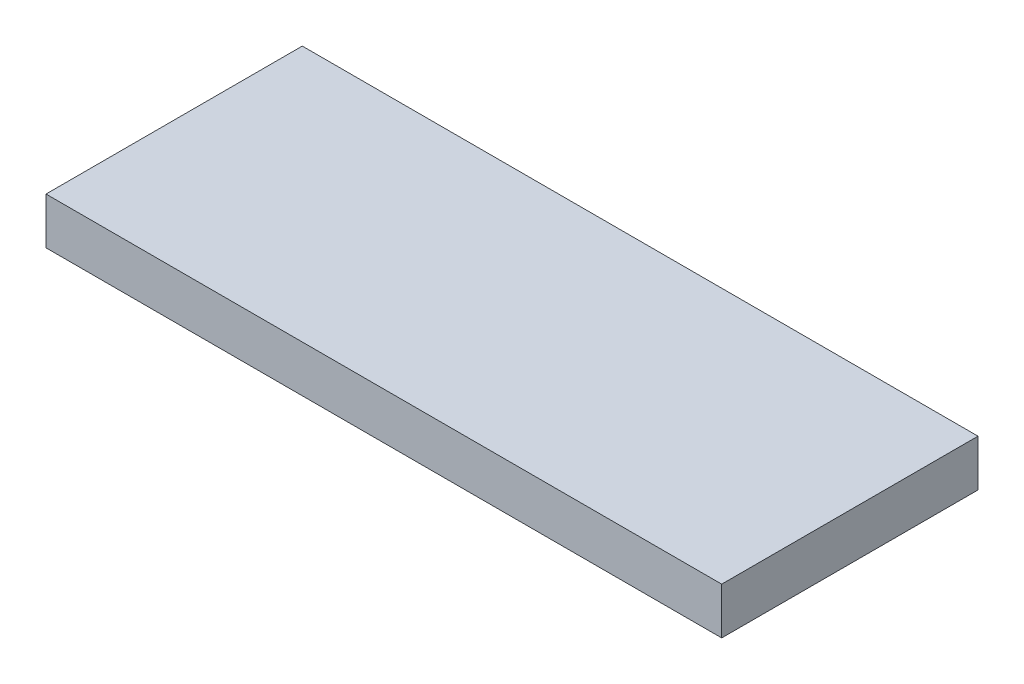
ISO-10303-21;
HEADER;
FILE_DESCRIPTION(('STEP AP214'),'2;1');
FILE_NAME('part.step','',(''),(''),'','','');
FILE_SCHEMA(('AUTOMOTIVE_DESIGN { 1 0 10303 214 1 1 1 1 }'));
ENDSEC;
DATA;
#1=APPLICATION_CONTEXT('core data for automotive mechanical design processes');
#2=APPLICATION_PROTOCOL_DEFINITION('international standard','automotive_design',2000,#1);
#3=PRODUCT_CONTEXT('',#1,'mechanical');
#4=PRODUCT('Part','Part','',(#3));
#5=PRODUCT_RELATED_PRODUCT_CATEGORY('part','',(#4));
#6=PRODUCT_DEFINITION_FORMATION('','',#4);
#7=PRODUCT_DEFINITION_CONTEXT('part definition',#1,'design');
#8=PRODUCT_DEFINITION('design','',#6,#7);
#9=PRODUCT_DEFINITION_SHAPE('','',#8);
#10=(LENGTH_UNIT() NAMED_UNIT(*) SI_UNIT(.MILLI.,.METRE.));
#11=(NAMED_UNIT(*) PLANE_ANGLE_UNIT() SI_UNIT($,.RADIAN.));
#12=(NAMED_UNIT(*) SI_UNIT($,.STERADIAN.) SOLID_ANGLE_UNIT());
#13=UNCERTAINTY_MEASURE_WITH_UNIT(LENGTH_MEASURE(1.E-05),#10,'distance_accuracy_value','');
#14=(GEOMETRIC_REPRESENTATION_CONTEXT(3) GLOBAL_UNCERTAINTY_ASSIGNED_CONTEXT((#13)) GLOBAL_UNIT_ASSIGNED_CONTEXT((#10,
#11,#12)) REPRESENTATION_CONTEXT('',''));
#15=CARTESIAN_POINT('',(0.,0.,0.));
#16=DIRECTION('',(0.,0.,1.));
#17=DIRECTION('',(1.,0.,0.));
#18=AXIS2_PLACEMENT_3D('',#15,#16,#17);
#19=CARTESIAN_POINT('',(184.15,25.4,-69.85));
#20=DIRECTION('',(-1.,0.,0.));
#21=DIRECTION('',(0.,0.,1.));
#22=AXIS2_PLACEMENT_3D('',#19,#20,#21);
#23=PLANE('',#22);
#24=DIRECTION('',(0.,0.,-1.));
#25=VECTOR('',#24,1.);
#26=CARTESIAN_POINT('',(184.15,0.,-69.85));
#27=LINE('',#26,#25);
#28=CARTESIAN_POINT('',(184.15,0.,69.85));
#29=VERTEX_POINT('',#28);
#30=CARTESIAN_POINT('',(184.15,0.,-69.85));
#31=VERTEX_POINT('',#30);
#32=EDGE_CURVE('E105',#29,#31,#27,.T.);
#33=ORIENTED_EDGE('',*,*,#32,.T.);
#34=DIRECTION('',(0.,-1.,0.));
#35=VECTOR('',#34,1.);
#36=CARTESIAN_POINT('',(184.15,25.4,-69.85));
#37=LINE('',#36,#35);
#38=CARTESIAN_POINT('',(184.15,25.4,-69.85));
#39=VERTEX_POINT('',#38);
#40=EDGE_CURVE('E11',#39,#31,#37,.T.);
#41=ORIENTED_EDGE('',*,*,#40,.F.);
#42=DIRECTION('',(0.,0.,-1.));
#43=VECTOR('',#42,1.);
#44=CARTESIAN_POINT('',(184.15,25.4,-69.85));
#45=LINE('',#44,#43);
#46=CARTESIAN_POINT('',(184.15,25.4,69.85));
#47=VERTEX_POINT('',#46);
#48=EDGE_CURVE('E93',#47,#39,#45,.T.);
#49=ORIENTED_EDGE('',*,*,#48,.F.);
#50=DIRECTION('',(0.,-1.,0.));
#51=VECTOR('',#50,1.);
#52=CARTESIAN_POINT('',(184.15,25.4,69.85));
#53=LINE('',#52,#51);
#54=EDGE_CURVE('E101',#47,#29,#53,.T.);
#55=ORIENTED_EDGE('',*,*,#54,.T.);
#56=EDGE_LOOP('',(#33,#41,#49,#55));
#57=FACE_BOUND('',#56,.T.);
#58=ADVANCED_FACE('F42',(#57),#23,.F.);
#59=CARTESIAN_POINT('',(-184.15,25.4,-69.85));
#60=DIRECTION('',(0.,0.,1.));
#61=DIRECTION('',(1.,0.,0.));
#62=AXIS2_PLACEMENT_3D('',#59,#60,#61);
#63=PLANE('',#62);
#64=DIRECTION('',(-1.,0.,0.));
#65=VECTOR('',#64,1.);
#66=CARTESIAN_POINT('',(-184.15,0.,-69.85));
#67=LINE('',#66,#65);
#68=CARTESIAN_POINT('',(-184.15,0.,-69.85));
#69=VERTEX_POINT('',#68);
#70=EDGE_CURVE('E97',#31,#69,#67,.T.);
#71=ORIENTED_EDGE('',*,*,#70,.T.);
#72=DIRECTION('',(0.,-1.,0.));
#73=VECTOR('',#72,1.);
#74=CARTESIAN_POINT('',(-184.15,25.4,-69.85));
#75=LINE('',#74,#73);
#76=CARTESIAN_POINT('',(-184.15,25.4,-69.85));
#77=VERTEX_POINT('',#76);
#78=EDGE_CURVE('E50',#77,#69,#75,.T.);
#79=ORIENTED_EDGE('',*,*,#78,.F.);
#80=DIRECTION('',(-1.,0.,0.));
#81=VECTOR('',#80,1.);
#82=CARTESIAN_POINT('',(-184.15,25.4,-69.85));
#83=LINE('',#82,#81);
#84=EDGE_CURVE('E88',#39,#77,#83,.T.);
#85=ORIENTED_EDGE('',*,*,#84,.F.);
#86=ORIENTED_EDGE('',*,*,#40,.T.);
#87=EDGE_LOOP('',(#71,#79,#85,#86));
#88=FACE_BOUND('',#87,.T.);
#89=ADVANCED_FACE('F96',(#88),#63,.F.);
#90=CARTESIAN_POINT('',(-184.15,25.4,-69.85));
#91=DIRECTION('',(1.,0.,0.));
#92=DIRECTION('',(0.,0.,-1.));
#93=AXIS2_PLACEMENT_3D('',#90,#91,#92);
#94=PLANE('',#93);
#95=DIRECTION('',(0.,0.,1.));
#96=VECTOR('',#95,1.);
#97=CARTESIAN_POINT('',(-184.15,0.,-69.85));
#98=LINE('',#97,#96);
#99=CARTESIAN_POINT('',(-184.15,0.,69.85));
#100=VERTEX_POINT('',#99);
#101=EDGE_CURVE('E75',#69,#100,#98,.T.);
#102=ORIENTED_EDGE('',*,*,#101,.T.);
#103=DIRECTION('',(0.,-1.,0.));
#104=VECTOR('',#103,1.);
#105=CARTESIAN_POINT('',(-184.15,25.4,69.85));
#106=LINE('',#105,#104);
#107=CARTESIAN_POINT('',(-184.15,25.4,69.85));
#108=VERTEX_POINT('',#107);
#109=EDGE_CURVE('E98',#108,#100,#106,.T.);
#110=ORIENTED_EDGE('',*,*,#109,.F.);
#111=DIRECTION('',(0.,0.,1.));
#112=VECTOR('',#111,1.);
#113=CARTESIAN_POINT('',(-184.15,25.4,-69.85));
#114=LINE('',#113,#112);
#115=EDGE_CURVE('E91',#77,#108,#114,.T.);
#116=ORIENTED_EDGE('',*,*,#115,.F.);
#117=ORIENTED_EDGE('',*,*,#78,.T.);
#118=EDGE_LOOP('',(#102,#110,#116,#117));
#119=FACE_BOUND('',#118,.T.);
#120=ADVANCED_FACE('F99',(#119),#94,.F.);
#121=CARTESIAN_POINT('',(-184.15,25.4,69.85));
#122=DIRECTION('',(0.,0.,-1.));
#123=DIRECTION('',(-1.,0.,0.));
#124=AXIS2_PLACEMENT_3D('',#121,#122,#123);
#125=PLANE('',#124);
#126=DIRECTION('',(1.,0.,0.));
#127=VECTOR('',#126,1.);
#128=CARTESIAN_POINT('',(-184.15,0.,69.85));
#129=LINE('',#128,#127);
#130=EDGE_CURVE('E81',#100,#29,#129,.T.);
#131=ORIENTED_EDGE('',*,*,#130,.T.);
#132=ORIENTED_EDGE('',*,*,#54,.F.);
#133=DIRECTION('',(1.,0.,0.));
#134=VECTOR('',#133,1.);
#135=CARTESIAN_POINT('',(-184.15,25.4,69.85));
#136=LINE('',#135,#134);
#137=EDGE_CURVE('E58',#108,#47,#136,.T.);
#138=ORIENTED_EDGE('',*,*,#137,.F.);
#139=ORIENTED_EDGE('',*,*,#109,.T.);
#140=EDGE_LOOP('',(#131,#132,#138,#139));
#141=FACE_BOUND('',#140,.T.);
#142=ADVANCED_FACE('F112',(#141),#125,.F.);
#143=CARTESIAN_POINT('',(0.,25.4,0.));
#144=DIRECTION('',(0.,1.,0.));
#145=DIRECTION('',(0.,0.,1.));
#146=AXIS2_PLACEMENT_3D('',#143,#144,#145);
#147=PLANE('',#146);
#148=ORIENTED_EDGE('',*,*,#48,.T.);
#149=ORIENTED_EDGE('',*,*,#84,.T.);
#150=ORIENTED_EDGE('',*,*,#115,.T.);
#151=ORIENTED_EDGE('',*,*,#137,.T.);
#152=EDGE_LOOP('',(#148,#149,#150,#151));
#153=FACE_BOUND('',#152,.T.);
#154=ADVANCED_FACE('F89',(#153),#147,.T.);
#155=CARTESIAN_POINT('',(0.,0.,0.));
#156=DIRECTION('',(0.,1.,0.));
#157=DIRECTION('',(0.,0.,1.));
#158=AXIS2_PLACEMENT_3D('',#155,#156,#157);
#159=PLANE('',#158);
#160=ORIENTED_EDGE('',*,*,#32,.F.);
#161=ORIENTED_EDGE('',*,*,#130,.F.);
#162=ORIENTED_EDGE('',*,*,#101,.F.);
#163=ORIENTED_EDGE('',*,*,#70,.F.);
#164=EDGE_LOOP('',(#160,#161,#162,#163));
#165=FACE_BOUND('',#164,.T.);
#166=ADVANCED_FACE('F115',(#165),#159,.F.);
#167=CLOSED_SHELL('',(#58,#89,#120,#142,#154,#166));
#168=MANIFOLD_SOLID_BREP('B2',#167);
#169=ADVANCED_BREP_SHAPE_REPRESENTATION('',(#18,#168),#14);
#170=SHAPE_DEFINITION_REPRESENTATION(#9,#169);
ENDSEC;
END-ISO-10303-21;
